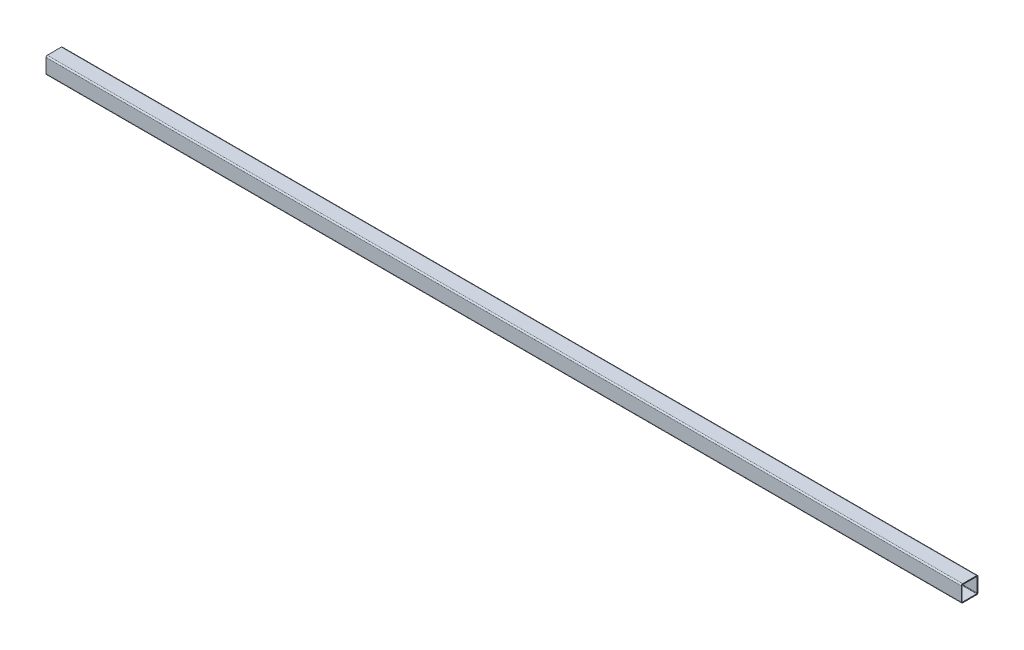
ISO-10303-21;
HEADER;
FILE_DESCRIPTION(('STEP AP214'),'2;1');
FILE_NAME('part.step','',(''),(''),'','','');
FILE_SCHEMA(('AUTOMOTIVE_DESIGN { 1 0 10303 214 1 1 1 1 }'));
ENDSEC;
DATA;
#1=APPLICATION_CONTEXT('core data for automotive mechanical design processes');
#2=APPLICATION_PROTOCOL_DEFINITION('international standard','automotive_design',2000,#1);
#3=PRODUCT_CONTEXT('',#1,'mechanical');
#4=PRODUCT('Part','Part','',(#3));
#5=PRODUCT_RELATED_PRODUCT_CATEGORY('part','',(#4));
#6=PRODUCT_DEFINITION_FORMATION('','',#4);
#7=PRODUCT_DEFINITION_CONTEXT('part definition',#1,'design');
#8=PRODUCT_DEFINITION('design','',#6,#7);
#9=PRODUCT_DEFINITION_SHAPE('','',#8);
#10=(LENGTH_UNIT() NAMED_UNIT(*) SI_UNIT(.MILLI.,.METRE.));
#11=(NAMED_UNIT(*) PLANE_ANGLE_UNIT() SI_UNIT($,.RADIAN.));
#12=(NAMED_UNIT(*) SI_UNIT($,.STERADIAN.) SOLID_ANGLE_UNIT());
#13=UNCERTAINTY_MEASURE_WITH_UNIT(LENGTH_MEASURE(1.E-05),#10,'distance_accuracy_value','');
#14=(GEOMETRIC_REPRESENTATION_CONTEXT(3) GLOBAL_UNCERTAINTY_ASSIGNED_CONTEXT((#13)) GLOBAL_UNIT_ASSIGNED_CONTEXT((#10,
#11,#12)) REPRESENTATION_CONTEXT('',''));
#15=CARTESIAN_POINT('',(0.,0.,0.));
#16=DIRECTION('',(0.,0.,1.));
#17=DIRECTION('',(1.,0.,0.));
#18=AXIS2_PLACEMENT_3D('',#15,#16,#17);
#19=CARTESIAN_POINT('',(698.5,10.541,21.209));
#20=DIRECTION('',(1.,0.,0.));
#21=DIRECTION('',(0.,0.,-1.));
#22=AXIS2_PLACEMENT_3D('',#19,#20,#21);
#23=PLANE('',#22);
#24=CARTESIAN_POINT('',(698.5,10.541,21.209));
#25=DIRECTION('',(1.,0.,0.));
#26=DIRECTION('',(0.,0.,-1.));
#27=AXIS2_PLACEMENT_3D('',#24,#25,#26);
#28=CIRCLE('',#27,1.016);
#29=CARTESIAN_POINT('',(698.5,10.541,22.225));
#30=VERTEX_POINT('',#29);
#31=CARTESIAN_POINT('',(698.5,9.525,21.209));
#32=VERTEX_POINT('',#31);
#33=EDGE_CURVE('E263',#30,#32,#28,.T.);
#34=ORIENTED_EDGE('',*,*,#33,.T.);
#35=DIRECTION('',(0.,0.,-1.));
#36=VECTOR('',#35,1.);
#37=CARTESIAN_POINT('',(698.5,9.525,21.209));
#38=LINE('',#37,#36);
#39=CARTESIAN_POINT('',(698.5,9.525,10.541));
#40=VERTEX_POINT('',#39);
#41=EDGE_CURVE('E477',#32,#40,#38,.T.);
#42=ORIENTED_EDGE('',*,*,#41,.T.);
#43=CARTESIAN_POINT('',(698.5,10.541,10.541));
#44=DIRECTION('',(1.,0.,0.));
#45=DIRECTION('',(0.,0.,-1.));
#46=AXIS2_PLACEMENT_3D('',#43,#44,#45);
#47=CIRCLE('',#46,1.016);
#48=CARTESIAN_POINT('',(698.5,10.541,9.52499999999999));
#49=VERTEX_POINT('',#48);
#50=EDGE_CURVE('E164',#40,#49,#47,.T.);
#51=ORIENTED_EDGE('',*,*,#50,.T.);
#52=DIRECTION('',(0.,1.,0.));
#53=VECTOR('',#52,1.);
#54=CARTESIAN_POINT('',(698.5,10.541,9.52499999999999));
#55=LINE('',#54,#53);
#56=CARTESIAN_POINT('',(698.5,21.209,9.52499999999999));
#57=VERTEX_POINT('',#56);
#58=EDGE_CURVE('E463',#49,#57,#55,.T.);
#59=ORIENTED_EDGE('',*,*,#58,.T.);
#60=CARTESIAN_POINT('',(698.5,21.209,10.541));
#61=DIRECTION('',(1.,0.,0.));
#62=DIRECTION('',(0.,0.,-1.));
#63=AXIS2_PLACEMENT_3D('',#60,#61,#62);
#64=CIRCLE('',#63,1.016);
#65=CARTESIAN_POINT('',(698.5,22.225,10.541));
#66=VERTEX_POINT('',#65);
#67=EDGE_CURVE('E472',#57,#66,#64,.T.);
#68=ORIENTED_EDGE('',*,*,#67,.T.);
#69=DIRECTION('',(0.,0.,1.));
#70=VECTOR('',#69,1.);
#71=CARTESIAN_POINT('',(698.5,22.225,10.541));
#72=LINE('',#71,#70);
#73=CARTESIAN_POINT('',(698.5,22.225,21.209));
#74=VERTEX_POINT('',#73);
#75=EDGE_CURVE('E279',#66,#74,#72,.T.);
#76=ORIENTED_EDGE('',*,*,#75,.T.);
#77=CARTESIAN_POINT('',(698.5,21.209,21.209));
#78=DIRECTION('',(1.,0.,0.));
#79=DIRECTION('',(0.,0.,-1.));
#80=AXIS2_PLACEMENT_3D('',#77,#78,#79);
#81=CIRCLE('',#80,1.01600000000001);
#82=CARTESIAN_POINT('',(698.5,21.209,22.225));
#83=VERTEX_POINT('',#82);
#84=EDGE_CURVE('E296',#74,#83,#81,.T.);
#85=ORIENTED_EDGE('',*,*,#84,.T.);
#86=DIRECTION('',(0.,-1.,0.));
#87=VECTOR('',#86,1.);
#88=CARTESIAN_POINT('',(698.5,21.209,22.225));
#89=LINE('',#88,#87);
#90=EDGE_CURVE('E260',#83,#30,#89,.T.);
#91=ORIENTED_EDGE('',*,*,#90,.T.);
#92=EDGE_LOOP('',(#34,#42,#51,#59,#68,#76,#85,#91));
#93=FACE_BOUND('',#92,.T.);
#94=DIRECTION('',(0.,1.,0.));
#95=VECTOR('',#94,1.);
#96=CARTESIAN_POINT('',(698.5,10.541,10.1854));
#97=LINE('',#96,#95);
#98=CARTESIAN_POINT('',(698.5,10.541,10.1854));
#99=VERTEX_POINT('',#98);
#100=CARTESIAN_POINT('',(698.5,21.209,10.1854));
#101=VERTEX_POINT('',#100);
#102=EDGE_CURVE('E256',#99,#101,#97,.T.);
#103=ORIENTED_EDGE('',*,*,#102,.F.);
#104=CARTESIAN_POINT('',(698.5,10.541,10.541));
#105=DIRECTION('',(1.,0.,0.));
#106=DIRECTION('',(0.,0.,-1.));
#107=AXIS2_PLACEMENT_3D('',#104,#105,#106);
#108=CIRCLE('',#107,0.355599999999999);
#109=CARTESIAN_POINT('',(698.5,10.1854,10.541));
#110=VERTEX_POINT('',#109);
#111=EDGE_CURVE('E103',#110,#99,#108,.T.);
#112=ORIENTED_EDGE('',*,*,#111,.F.);
#113=DIRECTION('',(0.,0.,-1.));
#114=VECTOR('',#113,1.);
#115=CARTESIAN_POINT('',(698.5,10.1854,21.209));
#116=LINE('',#115,#114);
#117=CARTESIAN_POINT('',(698.5,10.1854,21.209));
#118=VERTEX_POINT('',#117);
#119=EDGE_CURVE('E215',#118,#110,#116,.T.);
#120=ORIENTED_EDGE('',*,*,#119,.F.);
#121=CARTESIAN_POINT('',(698.5,10.541,21.209));
#122=DIRECTION('',(1.,0.,0.));
#123=DIRECTION('',(0.,0.,-1.));
#124=AXIS2_PLACEMENT_3D('',#121,#122,#123);
#125=CIRCLE('',#124,0.355599999999998);
#126=CARTESIAN_POINT('',(698.5,10.541,21.5646));
#127=VERTEX_POINT('',#126);
#128=EDGE_CURVE('E246',#127,#118,#125,.T.);
#129=ORIENTED_EDGE('',*,*,#128,.F.);
#130=DIRECTION('',(0.,-1.,0.));
#131=VECTOR('',#130,1.);
#132=CARTESIAN_POINT('',(698.5,21.209,21.5646));
#133=LINE('',#132,#131);
#134=CARTESIAN_POINT('',(698.5,21.209,21.5646));
#135=VERTEX_POINT('',#134);
#136=EDGE_CURVE('E232',#135,#127,#133,.T.);
#137=ORIENTED_EDGE('',*,*,#136,.F.);
#138=CARTESIAN_POINT('',(698.5,21.209,21.209));
#139=DIRECTION('',(1.,5.3297785544629E-13,5.3297785544629E-13));
#140=DIRECTION('',(5.3297785544629E-13,0.,-1.));
#141=AXIS2_PLACEMENT_3D('',#138,#139,#140);
#142=CIRCLE('',#141,0.355600000000008);
#143=CARTESIAN_POINT('',(698.5,21.5646,21.209));
#144=VERTEX_POINT('',#143);
#145=EDGE_CURVE('E241',#144,#135,#142,.T.);
#146=ORIENTED_EDGE('',*,*,#145,.F.);
#147=DIRECTION('',(0.,0.,1.));
#148=VECTOR('',#147,1.);
#149=CARTESIAN_POINT('',(698.5,21.5646,10.541));
#150=LINE('',#149,#148);
#151=CARTESIAN_POINT('',(698.5,21.5646,10.541));
#152=VERTEX_POINT('',#151);
#153=EDGE_CURVE('E249',#152,#144,#150,.T.);
#154=ORIENTED_EDGE('',*,*,#153,.F.);
#155=CARTESIAN_POINT('',(698.5,21.209,10.541));
#156=DIRECTION('',(1.,5.32977855446277E-13,-5.32977855446277E-13));
#157=DIRECTION('',(-5.32977855446277E-13,0.,-1.));
#158=AXIS2_PLACEMENT_3D('',#155,#156,#157);
#159=CIRCLE('',#158,0.355599999999998);
#160=EDGE_CURVE('E254',#101,#152,#159,.T.);
#161=ORIENTED_EDGE('',*,*,#160,.F.);
#162=EDGE_LOOP('',(#103,#112,#120,#129,#137,#146,#154,#161));
#163=FACE_BOUND('',#162,.T.);
#164=ADVANCED_FACE('F44',(#93,#163),#23,.T.);
#165=CARTESIAN_POINT('',(0.,10.541,21.209));
#166=DIRECTION('',(1.,0.,0.));
#167=DIRECTION('',(0.,0.,-1.));
#168=AXIS2_PLACEMENT_3D('',#165,#166,#167);
#169=PLANE('',#168);
#170=CARTESIAN_POINT('',(0.,10.541,21.209));
#171=DIRECTION('',(1.,0.,0.));
#172=DIRECTION('',(0.,0.,-1.));
#173=AXIS2_PLACEMENT_3D('',#170,#171,#172);
#174=CIRCLE('',#173,1.016);
#175=CARTESIAN_POINT('',(0.,10.541,22.225));
#176=VERTEX_POINT('',#175);
#177=CARTESIAN_POINT('',(0.,9.525,21.209));
#178=VERTEX_POINT('',#177);
#179=EDGE_CURVE('E157',#176,#178,#174,.T.);
#180=ORIENTED_EDGE('',*,*,#179,.F.);
#181=DIRECTION('',(0.,-1.,0.));
#182=VECTOR('',#181,1.);
#183=CARTESIAN_POINT('',(0.,21.209,22.225));
#184=LINE('',#183,#182);
#185=CARTESIAN_POINT('',(0.,21.209,22.225));
#186=VERTEX_POINT('',#185);
#187=EDGE_CURVE('E261',#186,#176,#184,.T.);
#188=ORIENTED_EDGE('',*,*,#187,.F.);
#189=CARTESIAN_POINT('',(0.,21.209,21.209));
#190=DIRECTION('',(1.,0.,0.));
#191=DIRECTION('',(0.,0.,-1.));
#192=AXIS2_PLACEMENT_3D('',#189,#190,#191);
#193=CIRCLE('',#192,1.01600000000001);
#194=CARTESIAN_POINT('',(0.,22.225,21.209));
#195=VERTEX_POINT('',#194);
#196=EDGE_CURVE('E264',#195,#186,#193,.T.);
#197=ORIENTED_EDGE('',*,*,#196,.F.);
#198=DIRECTION('',(0.,0.,1.));
#199=VECTOR('',#198,1.);
#200=CARTESIAN_POINT('',(0.,22.225,10.541));
#201=LINE('',#200,#199);
#202=CARTESIAN_POINT('',(0.,22.225,10.541));
#203=VERTEX_POINT('',#202);
#204=EDGE_CURVE('E266',#203,#195,#201,.T.);
#205=ORIENTED_EDGE('',*,*,#204,.F.);
#206=CARTESIAN_POINT('',(0.,21.209,10.541));
#207=DIRECTION('',(1.,0.,0.));
#208=DIRECTION('',(0.,0.,-1.));
#209=AXIS2_PLACEMENT_3D('',#206,#207,#208);
#210=CIRCLE('',#209,1.016);
#211=CARTESIAN_POINT('',(0.,21.209,9.52499999999999));
#212=VERTEX_POINT('',#211);
#213=EDGE_CURVE('E173',#212,#203,#210,.T.);
#214=ORIENTED_EDGE('',*,*,#213,.F.);
#215=DIRECTION('',(0.,1.,0.));
#216=VECTOR('',#215,1.);
#217=CARTESIAN_POINT('',(0.,10.541,9.52499999999999));
#218=LINE('',#217,#216);
#219=CARTESIAN_POINT('',(0.,10.541,9.52499999999999));
#220=VERTEX_POINT('',#219);
#221=EDGE_CURVE('E171',#220,#212,#218,.T.);
#222=ORIENTED_EDGE('',*,*,#221,.F.);
#223=CARTESIAN_POINT('',(0.,10.541,10.541));
#224=DIRECTION('',(1.,0.,0.));
#225=DIRECTION('',(0.,0.,-1.));
#226=AXIS2_PLACEMENT_3D('',#223,#224,#225);
#227=CIRCLE('',#226,1.016);
#228=CARTESIAN_POINT('',(0.,9.525,10.541));
#229=VERTEX_POINT('',#228);
#230=EDGE_CURVE('E156',#229,#220,#227,.T.);
#231=ORIENTED_EDGE('',*,*,#230,.F.);
#232=DIRECTION('',(0.,0.,-1.));
#233=VECTOR('',#232,1.);
#234=CARTESIAN_POINT('',(0.,9.525,21.209));
#235=LINE('',#234,#233);
#236=EDGE_CURVE('E146',#178,#229,#235,.T.);
#237=ORIENTED_EDGE('',*,*,#236,.F.);
#238=EDGE_LOOP('',(#180,#188,#197,#205,#214,#222,#231,#237));
#239=FACE_BOUND('',#238,.T.);
#240=CARTESIAN_POINT('',(0.,10.541,10.541));
#241=DIRECTION('',(1.,0.,0.));
#242=DIRECTION('',(0.,0.,-1.));
#243=AXIS2_PLACEMENT_3D('',#240,#241,#242);
#244=CIRCLE('',#243,0.355599999999999);
#245=CARTESIAN_POINT('',(0.,10.1854,10.541));
#246=VERTEX_POINT('',#245);
#247=CARTESIAN_POINT('',(0.,10.541,10.1854));
#248=VERTEX_POINT('',#247);
#249=EDGE_CURVE('E69',#246,#248,#244,.T.);
#250=ORIENTED_EDGE('',*,*,#249,.T.);
#251=DIRECTION('',(0.,1.,0.));
#252=VECTOR('',#251,1.);
#253=CARTESIAN_POINT('',(0.,10.541,10.1854));
#254=LINE('',#253,#252);
#255=CARTESIAN_POINT('',(0.,21.209,10.1854));
#256=VERTEX_POINT('',#255);
#257=EDGE_CURVE('E178',#248,#256,#254,.T.);
#258=ORIENTED_EDGE('',*,*,#257,.T.);
#259=CARTESIAN_POINT('',(0.,21.209,10.541));
#260=DIRECTION('',(1.,0.,0.));
#261=DIRECTION('',(0.,0.,-1.));
#262=AXIS2_PLACEMENT_3D('',#259,#260,#261);
#263=CIRCLE('',#262,0.355599999999998);
#264=CARTESIAN_POINT('',(0.,21.5646,10.541));
#265=VERTEX_POINT('',#264);
#266=EDGE_CURVE('E181',#256,#265,#263,.T.);
#267=ORIENTED_EDGE('',*,*,#266,.T.);
#268=DIRECTION('',(0.,0.,1.));
#269=VECTOR('',#268,1.);
#270=CARTESIAN_POINT('',(0.,21.5646,10.541));
#271=LINE('',#270,#269);
#272=CARTESIAN_POINT('',(0.,21.5646,21.209));
#273=VERTEX_POINT('',#272);
#274=EDGE_CURVE('E184',#265,#273,#271,.T.);
#275=ORIENTED_EDGE('',*,*,#274,.T.);
#276=CARTESIAN_POINT('',(0.,21.209,21.209));
#277=DIRECTION('',(1.,0.,0.));
#278=DIRECTION('',(0.,0.,-1.));
#279=AXIS2_PLACEMENT_3D('',#276,#277,#278);
#280=CIRCLE('',#279,0.355600000000008);
#281=CARTESIAN_POINT('',(0.,21.209,21.5646));
#282=VERTEX_POINT('',#281);
#283=EDGE_CURVE('E187',#273,#282,#280,.T.);
#284=ORIENTED_EDGE('',*,*,#283,.T.);
#285=DIRECTION('',(0.,-1.,0.));
#286=VECTOR('',#285,1.);
#287=CARTESIAN_POINT('',(0.,21.209,21.5646));
#288=LINE('',#287,#286);
#289=CARTESIAN_POINT('',(0.,10.541,21.5646));
#290=VERTEX_POINT('',#289);
#291=EDGE_CURVE('E190',#282,#290,#288,.T.);
#292=ORIENTED_EDGE('',*,*,#291,.T.);
#293=CARTESIAN_POINT('',(0.,10.541,21.209));
#294=DIRECTION('',(1.,0.,0.));
#295=DIRECTION('',(0.,0.,-1.));
#296=AXIS2_PLACEMENT_3D('',#293,#294,#295);
#297=CIRCLE('',#296,0.355599999999998);
#298=CARTESIAN_POINT('',(0.,10.1854,21.209));
#299=VERTEX_POINT('',#298);
#300=EDGE_CURVE('E193',#290,#299,#297,.T.);
#301=ORIENTED_EDGE('',*,*,#300,.T.);
#302=DIRECTION('',(0.,0.,-1.));
#303=VECTOR('',#302,1.);
#304=CARTESIAN_POINT('',(0.,10.1854,21.209));
#305=LINE('',#304,#303);
#306=EDGE_CURVE('E196',#299,#246,#305,.T.);
#307=ORIENTED_EDGE('',*,*,#306,.T.);
#308=EDGE_LOOP('',(#250,#258,#267,#275,#284,#292,#301,#307));
#309=FACE_BOUND('',#308,.T.);
#310=ADVANCED_FACE('F168',(#239,#309),#169,.F.);
#311=CARTESIAN_POINT('',(698.5,10.541,21.209));
#312=DIRECTION('',(-1.,0.,0.));
#313=DIRECTION('',(0.,0.,1.));
#314=AXIS2_PLACEMENT_3D('',#311,#312,#313);
#315=CYLINDRICAL_SURFACE('',#314,1.016);
#316=ORIENTED_EDGE('',*,*,#179,.T.);
#317=DIRECTION('',(-1.,0.,0.));
#318=VECTOR('',#317,1.);
#319=CARTESIAN_POINT('',(698.5,9.525,21.209));
#320=LINE('',#319,#318);
#321=EDGE_CURVE('E11',#32,#178,#320,.T.);
#322=ORIENTED_EDGE('',*,*,#321,.F.);
#323=ORIENTED_EDGE('',*,*,#33,.F.);
#324=DIRECTION('',(-1.,0.,0.));
#325=VECTOR('',#324,1.);
#326=CARTESIAN_POINT('',(698.5,10.541,22.225));
#327=LINE('',#326,#325);
#328=EDGE_CURVE('E212',#30,#176,#327,.T.);
#329=ORIENTED_EDGE('',*,*,#328,.T.);
#330=EDGE_LOOP('',(#316,#322,#323,#329));
#331=FACE_BOUND('',#330,.T.);
#332=ADVANCED_FACE('F326',(#331),#315,.T.);
#333=CARTESIAN_POINT('',(698.5,9.525,21.209));
#334=DIRECTION('',(0.,1.,0.));
#335=DIRECTION('',(0.,0.,1.));
#336=AXIS2_PLACEMENT_3D('',#333,#334,#335);
#337=PLANE('',#336);
#338=ORIENTED_EDGE('',*,*,#236,.T.);
#339=DIRECTION('',(-1.,0.,0.));
#340=VECTOR('',#339,1.);
#341=CARTESIAN_POINT('',(698.5,9.525,10.541));
#342=LINE('',#341,#340);
#343=EDGE_CURVE('E53',#40,#229,#342,.T.);
#344=ORIENTED_EDGE('',*,*,#343,.F.);
#345=ORIENTED_EDGE('',*,*,#41,.F.);
#346=ORIENTED_EDGE('',*,*,#321,.T.);
#347=EDGE_LOOP('',(#338,#344,#345,#346));
#348=FACE_BOUND('',#347,.T.);
#349=ADVANCED_FACE('F150',(#348),#337,.F.);
#350=CARTESIAN_POINT('',(698.5,10.541,10.541));
#351=DIRECTION('',(-1.,0.,0.));
#352=DIRECTION('',(0.,0.,1.));
#353=AXIS2_PLACEMENT_3D('',#350,#351,#352);
#354=CYLINDRICAL_SURFACE('',#353,1.016);
#355=ORIENTED_EDGE('',*,*,#230,.T.);
#356=DIRECTION('',(-1.,0.,0.));
#357=VECTOR('',#356,1.);
#358=CARTESIAN_POINT('',(698.5,10.541,9.52499999999999));
#359=LINE('',#358,#357);
#360=EDGE_CURVE('E165',#49,#220,#359,.T.);
#361=ORIENTED_EDGE('',*,*,#360,.F.);
#362=ORIENTED_EDGE('',*,*,#50,.F.);
#363=ORIENTED_EDGE('',*,*,#343,.T.);
#364=EDGE_LOOP('',(#355,#361,#362,#363));
#365=FACE_BOUND('',#364,.T.);
#366=ADVANCED_FACE('F160',(#365),#354,.T.);
#367=CARTESIAN_POINT('',(698.5,10.541,9.52499999999999));
#368=DIRECTION('',(0.,0.,1.));
#369=DIRECTION('',(1.,0.,0.));
#370=AXIS2_PLACEMENT_3D('',#367,#368,#369);
#371=PLANE('',#370);
#372=ORIENTED_EDGE('',*,*,#221,.T.);
#373=DIRECTION('',(-1.,0.,0.));
#374=VECTOR('',#373,1.);
#375=CARTESIAN_POINT('',(698.5,21.209,9.52499999999999));
#376=LINE('',#375,#374);
#377=EDGE_CURVE('E200',#57,#212,#376,.T.);
#378=ORIENTED_EDGE('',*,*,#377,.F.);
#379=ORIENTED_EDGE('',*,*,#58,.F.);
#380=ORIENTED_EDGE('',*,*,#360,.T.);
#381=EDGE_LOOP('',(#372,#378,#379,#380));
#382=FACE_BOUND('',#381,.T.);
#383=ADVANCED_FACE('F336',(#382),#371,.F.);
#384=CARTESIAN_POINT('',(698.5,21.209,10.541));
#385=DIRECTION('',(-1.,0.,0.));
#386=DIRECTION('',(0.,0.,1.));
#387=AXIS2_PLACEMENT_3D('',#384,#385,#386);
#388=CYLINDRICAL_SURFACE('',#387,1.016);
#389=ORIENTED_EDGE('',*,*,#213,.T.);
#390=DIRECTION('',(-1.,0.,0.));
#391=VECTOR('',#390,1.);
#392=CARTESIAN_POINT('',(698.5,22.225,10.541));
#393=LINE('',#392,#391);
#394=EDGE_CURVE('E203',#66,#203,#393,.T.);
#395=ORIENTED_EDGE('',*,*,#394,.F.);
#396=ORIENTED_EDGE('',*,*,#67,.F.);
#397=ORIENTED_EDGE('',*,*,#377,.T.);
#398=EDGE_LOOP('',(#389,#395,#396,#397));
#399=FACE_BOUND('',#398,.T.);
#400=ADVANCED_FACE('F269',(#399),#388,.T.);
#401=CARTESIAN_POINT('',(698.5,22.225,10.541));
#402=DIRECTION('',(0.,-1.,0.));
#403=DIRECTION('',(0.,0.,-1.));
#404=AXIS2_PLACEMENT_3D('',#401,#402,#403);
#405=PLANE('',#404);
#406=ORIENTED_EDGE('',*,*,#204,.T.);
#407=DIRECTION('',(-1.,0.,0.));
#408=VECTOR('',#407,1.);
#409=CARTESIAN_POINT('',(698.5,22.225,21.209));
#410=LINE('',#409,#408);
#411=EDGE_CURVE('E206',#74,#195,#410,.T.);
#412=ORIENTED_EDGE('',*,*,#411,.F.);
#413=ORIENTED_EDGE('',*,*,#75,.F.);
#414=ORIENTED_EDGE('',*,*,#394,.T.);
#415=EDGE_LOOP('',(#406,#412,#413,#414));
#416=FACE_BOUND('',#415,.T.);
#417=ADVANCED_FACE('F276',(#416),#405,.F.);
#418=CARTESIAN_POINT('',(698.5,21.209,21.209));
#419=DIRECTION('',(-1.,0.,0.));
#420=DIRECTION('',(0.,0.,1.));
#421=AXIS2_PLACEMENT_3D('',#418,#419,#420);
#422=CYLINDRICAL_SURFACE('',#421,1.016);
#423=ORIENTED_EDGE('',*,*,#196,.T.);
#424=DIRECTION('',(-1.,0.,0.));
#425=VECTOR('',#424,1.);
#426=CARTESIAN_POINT('',(698.5,21.209,22.225));
#427=LINE('',#426,#425);
#428=EDGE_CURVE('E209',#83,#186,#427,.T.);
#429=ORIENTED_EDGE('',*,*,#428,.F.);
#430=ORIENTED_EDGE('',*,*,#84,.F.);
#431=ORIENTED_EDGE('',*,*,#411,.T.);
#432=EDGE_LOOP('',(#423,#429,#430,#431));
#433=FACE_BOUND('',#432,.T.);
#434=ADVANCED_FACE('F284',(#433),#422,.T.);
#435=CARTESIAN_POINT('',(698.5,21.209,22.225));
#436=DIRECTION('',(0.,0.,-1.));
#437=DIRECTION('',(0.,1.,0.));
#438=AXIS2_PLACEMENT_3D('',#435,#436,#437);
#439=PLANE('',#438);
#440=ORIENTED_EDGE('',*,*,#187,.T.);
#441=ORIENTED_EDGE('',*,*,#328,.F.);
#442=ORIENTED_EDGE('',*,*,#90,.F.);
#443=ORIENTED_EDGE('',*,*,#428,.T.);
#444=EDGE_LOOP('',(#440,#441,#442,#443));
#445=FACE_BOUND('',#444,.T.);
#446=ADVANCED_FACE('F288',(#445),#439,.F.);
#447=CARTESIAN_POINT('',(698.5,10.541,10.541));
#448=DIRECTION('',(-1.,0.,0.));
#449=DIRECTION('',(0.,0.,1.));
#450=AXIS2_PLACEMENT_3D('',#447,#448,#449);
#451=CYLINDRICAL_SURFACE('',#450,0.3556);
#452=ORIENTED_EDGE('',*,*,#249,.F.);
#453=DIRECTION('',(-1.,0.,0.));
#454=VECTOR('',#453,1.);
#455=CARTESIAN_POINT('',(698.5,10.1854,10.541));
#456=LINE('',#455,#454);
#457=EDGE_CURVE('E213',#110,#246,#456,.T.);
#458=ORIENTED_EDGE('',*,*,#457,.F.);
#459=ORIENTED_EDGE('',*,*,#111,.T.);
#460=DIRECTION('',(-1.,0.,0.));
#461=VECTOR('',#460,1.);
#462=CARTESIAN_POINT('',(698.5,10.541,10.1854));
#463=LINE('',#462,#461);
#464=EDGE_CURVE('E216',#99,#248,#463,.T.);
#465=ORIENTED_EDGE('',*,*,#464,.T.);
#466=EDGE_LOOP('',(#452,#458,#459,#465));
#467=FACE_BOUND('',#466,.T.);
#468=ADVANCED_FACE('F302',(#467),#451,.F.);
#469=CARTESIAN_POINT('',(698.5,10.541,10.1854));
#470=DIRECTION('',(0.,0.,1.));
#471=DIRECTION('',(1.,0.,0.));
#472=AXIS2_PLACEMENT_3D('',#469,#470,#471);
#473=PLANE('',#472);
#474=ORIENTED_EDGE('',*,*,#257,.F.);
#475=ORIENTED_EDGE('',*,*,#464,.F.);
#476=ORIENTED_EDGE('',*,*,#102,.T.);
#477=DIRECTION('',(-1.,0.,0.));
#478=VECTOR('',#477,1.);
#479=CARTESIAN_POINT('',(698.5,21.209,10.1854));
#480=LINE('',#479,#478);
#481=EDGE_CURVE('E218',#101,#256,#480,.T.);
#482=ORIENTED_EDGE('',*,*,#481,.T.);
#483=EDGE_LOOP('',(#474,#475,#476,#482));
#484=FACE_BOUND('',#483,.T.);
#485=ADVANCED_FACE('F306',(#484),#473,.T.);
#486=CARTESIAN_POINT('',(698.5,21.209,10.541));
#487=DIRECTION('',(-1.,0.,0.));
#488=DIRECTION('',(0.,0.,1.));
#489=AXIS2_PLACEMENT_3D('',#486,#487,#488);
#490=CYLINDRICAL_SURFACE('',#489,0.3556);
#491=ORIENTED_EDGE('',*,*,#266,.F.);
#492=ORIENTED_EDGE('',*,*,#481,.F.);
#493=ORIENTED_EDGE('',*,*,#160,.T.);
#494=DIRECTION('',(-1.,0.,0.));
#495=VECTOR('',#494,1.);
#496=CARTESIAN_POINT('',(698.5,21.5646,10.541));
#497=LINE('',#496,#495);
#498=EDGE_CURVE('E220',#152,#265,#497,.T.);
#499=ORIENTED_EDGE('',*,*,#498,.T.);
#500=EDGE_LOOP('',(#491,#492,#493,#499));
#501=FACE_BOUND('',#500,.T.);
#502=ADVANCED_FACE('F309',(#501),#490,.F.);
#503=CARTESIAN_POINT('',(698.5,21.5646,10.541));
#504=DIRECTION('',(0.,-1.,0.));
#505=DIRECTION('',(0.,0.,-1.));
#506=AXIS2_PLACEMENT_3D('',#503,#504,#505);
#507=PLANE('',#506);
#508=ORIENTED_EDGE('',*,*,#274,.F.);
#509=ORIENTED_EDGE('',*,*,#498,.F.);
#510=ORIENTED_EDGE('',*,*,#153,.T.);
#511=DIRECTION('',(-1.,0.,0.));
#512=VECTOR('',#511,1.);
#513=CARTESIAN_POINT('',(698.5,21.5646,21.209));
#514=LINE('',#513,#512);
#515=EDGE_CURVE('E222',#144,#273,#514,.T.);
#516=ORIENTED_EDGE('',*,*,#515,.T.);
#517=EDGE_LOOP('',(#508,#509,#510,#516));
#518=FACE_BOUND('',#517,.T.);
#519=ADVANCED_FACE('F312',(#518),#507,.T.);
#520=CARTESIAN_POINT('',(698.5,21.209,21.209));
#521=DIRECTION('',(-1.,0.,0.));
#522=DIRECTION('',(0.,0.,1.));
#523=AXIS2_PLACEMENT_3D('',#520,#521,#522);
#524=CYLINDRICAL_SURFACE('',#523,0.355600000000003);
#525=ORIENTED_EDGE('',*,*,#283,.F.);
#526=ORIENTED_EDGE('',*,*,#515,.F.);
#527=ORIENTED_EDGE('',*,*,#145,.T.);
#528=DIRECTION('',(-1.,0.,0.));
#529=VECTOR('',#528,1.);
#530=CARTESIAN_POINT('',(698.5,21.209,21.5646));
#531=LINE('',#530,#529);
#532=EDGE_CURVE('E224',#135,#282,#531,.T.);
#533=ORIENTED_EDGE('',*,*,#532,.T.);
#534=EDGE_LOOP('',(#525,#526,#527,#533));
#535=FACE_BOUND('',#534,.T.);
#536=ADVANCED_FACE('F239',(#535),#524,.F.);
#537=CARTESIAN_POINT('',(698.5,21.209,21.5646));
#538=DIRECTION('',(0.,0.,-1.));
#539=DIRECTION('',(-1.,0.,0.));
#540=AXIS2_PLACEMENT_3D('',#537,#538,#539);
#541=PLANE('',#540);
#542=ORIENTED_EDGE('',*,*,#291,.F.);
#543=ORIENTED_EDGE('',*,*,#532,.F.);
#544=ORIENTED_EDGE('',*,*,#136,.T.);
#545=DIRECTION('',(-1.,0.,0.));
#546=VECTOR('',#545,1.);
#547=CARTESIAN_POINT('',(698.5,10.541,21.5646));
#548=LINE('',#547,#546);
#549=EDGE_CURVE('E225',#127,#290,#548,.T.);
#550=ORIENTED_EDGE('',*,*,#549,.T.);
#551=EDGE_LOOP('',(#542,#543,#544,#550));
#552=FACE_BOUND('',#551,.T.);
#553=ADVANCED_FACE('F229',(#552),#541,.T.);
#554=CARTESIAN_POINT('',(698.5,10.541,21.209));
#555=DIRECTION('',(-1.,0.,0.));
#556=DIRECTION('',(0.,0.,1.));
#557=AXIS2_PLACEMENT_3D('',#554,#555,#556);
#558=CYLINDRICAL_SURFACE('',#557,0.355600000000001);
#559=ORIENTED_EDGE('',*,*,#300,.F.);
#560=ORIENTED_EDGE('',*,*,#549,.F.);
#561=ORIENTED_EDGE('',*,*,#128,.T.);
#562=DIRECTION('',(-1.,0.,0.));
#563=VECTOR('',#562,1.);
#564=CARTESIAN_POINT('',(698.5,10.1854,21.209));
#565=LINE('',#564,#563);
#566=EDGE_CURVE('E48',#118,#299,#565,.T.);
#567=ORIENTED_EDGE('',*,*,#566,.T.);
#568=EDGE_LOOP('',(#559,#560,#561,#567));
#569=FACE_BOUND('',#568,.T.);
#570=ADVANCED_FACE('F234',(#569),#558,.F.);
#571=CARTESIAN_POINT('',(698.5,10.1854,21.209));
#572=DIRECTION('',(0.,1.,0.));
#573=DIRECTION('',(0.,0.,1.));
#574=AXIS2_PLACEMENT_3D('',#571,#572,#573);
#575=PLANE('',#574);
#576=ORIENTED_EDGE('',*,*,#306,.F.);
#577=ORIENTED_EDGE('',*,*,#566,.F.);
#578=ORIENTED_EDGE('',*,*,#119,.T.);
#579=ORIENTED_EDGE('',*,*,#457,.T.);
#580=EDGE_LOOP('',(#576,#577,#578,#579));
#581=FACE_BOUND('',#580,.T.);
#582=ADVANCED_FACE('F46',(#581),#575,.T.);
#583=CLOSED_SHELL('',(#164,#310,#332,#349,#366,#383,#400,#417,#434,#446,#468,#485,#502,#519,
#536,#553,#570,#582));
#584=MANIFOLD_SOLID_BREP('B2',#583);
#585=ADVANCED_BREP_SHAPE_REPRESENTATION('',(#18,#584),#14);
#586=SHAPE_DEFINITION_REPRESENTATION(#9,#585);
ENDSEC;
END-ISO-10303-21;
